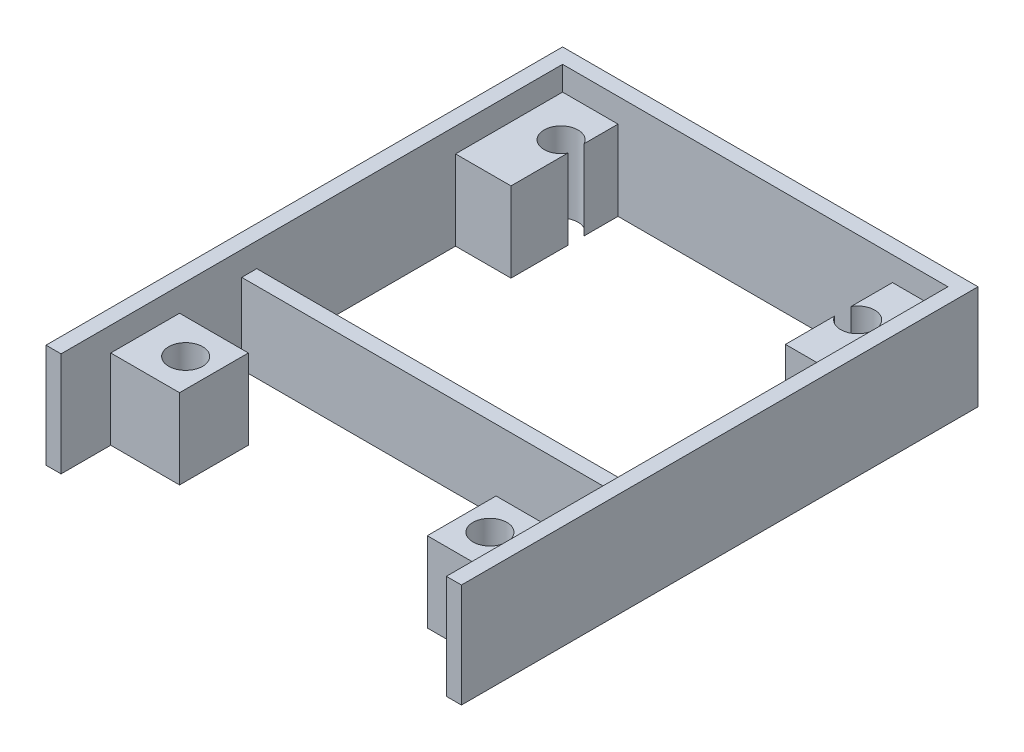
ISO-10303-21;
HEADER;
FILE_DESCRIPTION(('STEP AP214'),'2;1');
FILE_NAME('part.step','',(''),(''),'','','');
FILE_SCHEMA(('AUTOMOTIVE_DESIGN { 1 0 10303 214 1 1 1 1 }'));
ENDSEC;
DATA;
#1=APPLICATION_CONTEXT('core data for automotive mechanical design processes');
#2=APPLICATION_PROTOCOL_DEFINITION('international standard','automotive_design',2000,#1);
#3=PRODUCT_CONTEXT('',#1,'mechanical');
#4=PRODUCT('Part','Part','',(#3));
#5=PRODUCT_RELATED_PRODUCT_CATEGORY('part','',(#4));
#6=PRODUCT_DEFINITION_FORMATION('','',#4);
#7=PRODUCT_DEFINITION_CONTEXT('part definition',#1,'design');
#8=PRODUCT_DEFINITION('design','',#6,#7);
#9=PRODUCT_DEFINITION_SHAPE('','',#8);
#10=(LENGTH_UNIT() NAMED_UNIT(*) SI_UNIT(.MILLI.,.METRE.));
#11=(NAMED_UNIT(*) PLANE_ANGLE_UNIT() SI_UNIT($,.RADIAN.));
#12=(NAMED_UNIT(*) SI_UNIT($,.STERADIAN.) SOLID_ANGLE_UNIT());
#13=UNCERTAINTY_MEASURE_WITH_UNIT(LENGTH_MEASURE(1.E-05),#10,'distance_accuracy_value','');
#14=(GEOMETRIC_REPRESENTATION_CONTEXT(3) GLOBAL_UNCERTAINTY_ASSIGNED_CONTEXT((#13)) GLOBAL_UNIT_ASSIGNED_CONTEXT((#10,
#11,#12)) REPRESENTATION_CONTEXT('',''));
#15=CARTESIAN_POINT('',(0.,0.,0.));
#16=DIRECTION('',(0.,0.,1.));
#17=DIRECTION('',(1.,0.,0.));
#18=AXIS2_PLACEMENT_3D('',#15,#16,#17);
#19=CARTESIAN_POINT('',(11.9924285714286,-12.93,-8.03365714285714));
#20=DIRECTION('',(-1.,0.,0.));
#21=DIRECTION('',(0.,0.,1.));
#22=AXIS2_PLACEMENT_3D('',#19,#20,#21);
#23=PLANE('',#22);
#24=DIRECTION('',(0.,1.,0.));
#25=VECTOR('',#24,1.);
#26=CARTESIAN_POINT('',(11.9924285714286,-12.93,-8.03365714285714));
#27=LINE('',#26,#25);
#28=CARTESIAN_POINT('',(11.9924285714286,-5.31,-8.03365714285714));
#29=VERTEX_POINT('',#28);
#30=CARTESIAN_POINT('',(11.9924285714286,0.,-8.03365714285714));
#31=VERTEX_POINT('',#30);
#32=EDGE_CURVE('E305',#29,#31,#27,.T.);
#33=ORIENTED_EDGE('',*,*,#32,.F.);
#34=DIRECTION('',(0.,0.,1.));
#35=VECTOR('',#34,1.);
#36=CARTESIAN_POINT('',(11.9924285714286,-5.31,-8.03365714285714));
#37=LINE('',#36,#35);
#38=CARTESIAN_POINT('',(11.9924285714286,-5.31,-5.27598216524725));
#39=VERTEX_POINT('',#38);
#40=EDGE_CURVE('E285',#29,#39,#37,.T.);
#41=ORIENTED_EDGE('',*,*,#40,.T.);
#42=DIRECTION('',(0.,-1.,0.));
#43=VECTOR('',#42,1.);
#44=CARTESIAN_POINT('',(11.9924285714286,1.6002,-5.27598216524725));
#45=LINE('',#44,#43);
#46=CARTESIAN_POINT('',(11.9924285714286,0.,-5.27598216524725));
#47=VERTEX_POINT('',#46);
#48=EDGE_CURVE('E269',#47,#39,#45,.T.);
#49=ORIENTED_EDGE('',*,*,#48,.F.);
#50=DIRECTION('',(0.,0.,1.));
#51=VECTOR('',#50,1.);
#52=CARTESIAN_POINT('',(11.9924285714286,0.,-8.03365714285714));
#53=LINE('',#52,#51);
#54=EDGE_CURVE('E284',#31,#47,#53,.T.);
#55=ORIENTED_EDGE('',*,*,#54,.F.);
#56=EDGE_LOOP('',(#33,#41,#49,#55));
#57=FACE_BOUND('',#56,.T.);
#58=ADVANCED_FACE('F33',(#57),#23,.T.);
#59=CARTESIAN_POINT('',(-6.24477142857143,-12.93,-8.03365714285714));
#60=DIRECTION('',(1.,0.,0.));
#61=DIRECTION('',(0.,0.,-1.));
#62=AXIS2_PLACEMENT_3D('',#59,#60,#61);
#63=PLANE('',#62);
#64=DIRECTION('',(0.,1.,0.));
#65=VECTOR('',#64,1.);
#66=CARTESIAN_POINT('',(-6.24477142857143,-12.93,-0.92165714285714));
#67=LINE('',#66,#65);
#68=CARTESIAN_POINT('',(-6.24477142857143,-5.31,-0.92165714285714));
#69=VERTEX_POINT('',#68);
#70=CARTESIAN_POINT('',(-6.24477142857143,0.,-0.92165714285714));
#71=VERTEX_POINT('',#70);
#72=EDGE_CURVE('E253',#69,#71,#67,.T.);
#73=ORIENTED_EDGE('',*,*,#72,.F.);
#74=DIRECTION('',(0.,0.,-1.));
#75=VECTOR('',#74,1.);
#76=CARTESIAN_POINT('',(-6.24477142857143,-5.31,-8.03365714285714));
#77=LINE('',#76,#75);
#78=CARTESIAN_POINT('',(-6.24477142857143,-5.31,-4.69533212046702));
#79=VERTEX_POINT('',#78);
#80=EDGE_CURVE('E520',#69,#79,#77,.T.);
#81=ORIENTED_EDGE('',*,*,#80,.T.);
#82=DIRECTION('',(0.,-1.,0.));
#83=VECTOR('',#82,1.);
#84=CARTESIAN_POINT('',(-6.24477142857143,1.6002,-4.69533212046702));
#85=LINE('',#84,#83);
#86=CARTESIAN_POINT('',(-6.24477142857143,0.,-4.69533212046702));
#87=VERTEX_POINT('',#86);
#88=EDGE_CURVE('E263',#87,#79,#85,.T.);
#89=ORIENTED_EDGE('',*,*,#88,.F.);
#90=DIRECTION('',(0.,0.,-1.));
#91=VECTOR('',#90,1.);
#92=CARTESIAN_POINT('',(-6.24477142857143,0.,-8.03365714285714));
#93=LINE('',#92,#91);
#94=EDGE_CURVE('E311',#71,#87,#93,.T.);
#95=ORIENTED_EDGE('',*,*,#94,.F.);
#96=EDGE_LOOP('',(#73,#81,#89,#95));
#97=FACE_BOUND('',#96,.T.);
#98=ADVANCED_FACE('F554',(#97),#63,.T.);
#99=CARTESIAN_POINT('',(-10.9277714285714,-12.93,-9.03365714285714));
#100=DIRECTION('',(-1.,0.,0.));
#101=DIRECTION('',(0.,0.,1.));
#102=AXIS2_PLACEMENT_3D('',#99,#100,#101);
#103=PLANE('',#102);
#104=DIRECTION('',(0.,1.,0.));
#105=VECTOR('',#104,1.);
#106=CARTESIAN_POINT('',(-10.9277714285714,-12.93,-9.03365714285714));
#107=LINE('',#106,#105);
#108=CARTESIAN_POINT('',(-10.9277714285714,-5.31,-9.03365714285714));
#109=VERTEX_POINT('',#108);
#110=CARTESIAN_POINT('',(-10.9277714285714,1.6002,-9.03365714285714));
#111=VERTEX_POINT('',#110);
#112=EDGE_CURVE('E251',#109,#111,#107,.T.);
#113=ORIENTED_EDGE('',*,*,#112,.F.);
#114=DIRECTION('',(0.,0.,1.));
#115=VECTOR('',#114,1.);
#116=CARTESIAN_POINT('',(-10.9277714285714,-5.31,-9.03365714285714));
#117=LINE('',#116,#115);
#118=CARTESIAN_POINT('',(-10.9277714285714,-5.31,25.2911428571429));
#119=VERTEX_POINT('',#118);
#120=EDGE_CURVE('E483',#109,#119,#117,.T.);
#121=ORIENTED_EDGE('',*,*,#120,.T.);
#122=DIRECTION('',(0.,-1.,0.));
#123=VECTOR('',#122,1.);
#124=CARTESIAN_POINT('',(-10.9277714285714,1.6002,25.2911428571429));
#125=LINE('',#124,#123);
#126=CARTESIAN_POINT('',(-10.9277714285714,1.6002,25.2911428571429));
#127=VERTEX_POINT('',#126);
#128=EDGE_CURVE('E482',#127,#119,#125,.T.);
#129=ORIENTED_EDGE('',*,*,#128,.F.);
#130=DIRECTION('',(0.,0.,1.));
#131=VECTOR('',#130,1.);
#132=CARTESIAN_POINT('',(-10.9277714285714,1.6002,26.2911428571429));
#133=LINE('',#132,#131);
#134=EDGE_CURVE('E384',#111,#127,#133,.T.);
#135=ORIENTED_EDGE('',*,*,#134,.F.);
#136=EDGE_LOOP('',(#113,#121,#129,#135));
#137=FACE_BOUND('',#136,.T.);
#138=ADVANCED_FACE('F35',(#137),#103,.T.);
#139=CARTESIAN_POINT('',(-10.9277714285714,-12.93,-9.03365714285714));
#140=DIRECTION('',(0.,0.,-1.));
#141=DIRECTION('',(-1.,0.,0.));
#142=AXIS2_PLACEMENT_3D('',#139,#140,#141);
#143=PLANE('',#142);
#144=DIRECTION('',(0.,1.,0.));
#145=VECTOR('',#144,1.);
#146=CARTESIAN_POINT('',(16.6754285714286,-12.93,-9.03365714285714));
#147=LINE('',#146,#145);
#148=CARTESIAN_POINT('',(16.6754285714286,-5.31,-9.03365714285714));
#149=VERTEX_POINT('',#148);
#150=CARTESIAN_POINT('',(16.6754285714286,1.6002,-9.03365714285714));
#151=VERTEX_POINT('',#150);
#152=EDGE_CURVE('E248',#149,#151,#147,.T.);
#153=ORIENTED_EDGE('',*,*,#152,.F.);
#154=DIRECTION('',(-1.,0.,0.));
#155=VECTOR('',#154,1.);
#156=CARTESIAN_POINT('',(-10.9277714285714,-5.31,-9.03365714285714));
#157=LINE('',#156,#155);
#158=EDGE_CURVE('E797',#149,#109,#157,.T.);
#159=ORIENTED_EDGE('',*,*,#158,.T.);
#160=ORIENTED_EDGE('',*,*,#112,.T.);
#161=DIRECTION('',(-1.,0.,0.));
#162=VECTOR('',#161,1.);
#163=CARTESIAN_POINT('',(-10.9277714285714,1.6002,-9.03365714285714));
#164=LINE('',#163,#162);
#165=EDGE_CURVE('E467',#151,#111,#164,.T.);
#166=ORIENTED_EDGE('',*,*,#165,.F.);
#167=EDGE_LOOP('',(#153,#159,#160,#166));
#168=FACE_BOUND('',#167,.T.);
#169=ADVANCED_FACE('F676',(#168),#143,.T.);
#170=CARTESIAN_POINT('',(16.6754285714286,-12.93,-9.03365714285714));
#171=DIRECTION('',(1.,0.,0.));
#172=DIRECTION('',(0.,0.,-1.));
#173=AXIS2_PLACEMENT_3D('',#170,#171,#172);
#174=PLANE('',#173);
#175=DIRECTION('',(0.,-1.,0.));
#176=VECTOR('',#175,1.);
#177=CARTESIAN_POINT('',(16.6754285714286,1.6002,25.2911428571429));
#178=LINE('',#177,#176);
#179=CARTESIAN_POINT('',(16.6754285714286,1.6002,25.2911428571429));
#180=VERTEX_POINT('',#179);
#181=CARTESIAN_POINT('',(16.6754285714286,-5.31,25.2911428571429));
#182=VERTEX_POINT('',#181);
#183=EDGE_CURVE('E486',#180,#182,#178,.T.);
#184=ORIENTED_EDGE('',*,*,#183,.T.);
#185=DIRECTION('',(0.,0.,-1.));
#186=VECTOR('',#185,1.);
#187=CARTESIAN_POINT('',(16.6754285714286,-5.31,-9.03365714285714));
#188=LINE('',#187,#186);
#189=EDGE_CURVE('E55',#182,#149,#188,.T.);
#190=ORIENTED_EDGE('',*,*,#189,.T.);
#191=ORIENTED_EDGE('',*,*,#152,.T.);
#192=DIRECTION('',(0.,0.,-1.));
#193=VECTOR('',#192,1.);
#194=CARTESIAN_POINT('',(16.6754285714286,1.6002,26.2911428571429));
#195=LINE('',#194,#193);
#196=EDGE_CURVE('E462',#180,#151,#195,.T.);
#197=ORIENTED_EDGE('',*,*,#196,.F.);
#198=EDGE_LOOP('',(#184,#190,#191,#197));
#199=FACE_BOUND('',#198,.T.);
#200=ADVANCED_FACE('F684',(#199),#174,.T.);
#201=CARTESIAN_POINT('',(-9.92777142857143,-12.93,-8.03365714285714));
#202=DIRECTION('',(-1.,0.,0.));
#203=DIRECTION('',(0.,0.,1.));
#204=AXIS2_PLACEMENT_3D('',#201,#202,#203);
#205=PLANE('',#204);
#206=DIRECTION('',(0.,0.,1.));
#207=VECTOR('',#206,1.);
#208=CARTESIAN_POINT('',(-9.92777142857143,-5.31,-8.03365714285714));
#209=LINE('',#208,#207);
#210=CARTESIAN_POINT('',(-9.92777142857143,-5.31,-0.92165714285714));
#211=VERTEX_POINT('',#210);
#212=CARTESIAN_POINT('',(-9.92777142857143,-5.31,12.2863428571429));
#213=VERTEX_POINT('',#212);
#214=EDGE_CURVE('E48',#211,#213,#209,.T.);
#215=ORIENTED_EDGE('',*,*,#214,.F.);
#216=DIRECTION('',(0.,1.,0.));
#217=VECTOR('',#216,1.);
#218=CARTESIAN_POINT('',(-9.92777142857143,-12.93,-0.921657142857145));
#219=LINE('',#218,#217);
#220=CARTESIAN_POINT('',(-9.92777142857142,0.,-0.921657142857139));
#221=VERTEX_POINT('',#220);
#222=EDGE_CURVE('E317',#211,#221,#219,.T.);
#223=ORIENTED_EDGE('',*,*,#222,.T.);
#224=DIRECTION('',(0.,0.,1.));
#225=VECTOR('',#224,1.);
#226=CARTESIAN_POINT('',(-9.92777142857142,0.,25.2911428571429));
#227=LINE('',#226,#225);
#228=CARTESIAN_POINT('',(-9.92777142857142,0.,-8.03365714285714));
#229=VERTEX_POINT('',#228);
#230=EDGE_CURVE('E347',#229,#221,#227,.T.);
#231=ORIENTED_EDGE('',*,*,#230,.F.);
#232=DIRECTION('',(0.,-1.,0.));
#233=VECTOR('',#232,1.);
#234=CARTESIAN_POINT('',(-9.92777142857142,1.6002,-8.03365714285714));
#235=LINE('',#234,#233);
#236=CARTESIAN_POINT('',(-9.92777142857142,1.6002,-8.03365714285714));
#237=VERTEX_POINT('',#236);
#238=EDGE_CURVE('E340',#237,#229,#235,.T.);
#239=ORIENTED_EDGE('',*,*,#238,.F.);
#240=DIRECTION('',(0.,0.,1.));
#241=VECTOR('',#240,1.);
#242=CARTESIAN_POINT('',(-9.92777142857142,1.6002,25.2911428571429));
#243=LINE('',#242,#241);
#244=CARTESIAN_POINT('',(-9.92777142857142,1.6002,25.2911428571429));
#245=VERTEX_POINT('',#244);
#246=EDGE_CURVE('E346',#237,#245,#243,.T.);
#247=ORIENTED_EDGE('',*,*,#246,.T.);
#248=DIRECTION('',(0.,1.,0.));
#249=VECTOR('',#248,1.);
#250=CARTESIAN_POINT('',(-9.92777142857142,-12.93,25.2911428571429));
#251=LINE('',#250,#249);
#252=CARTESIAN_POINT('',(-9.92777142857142,-5.31,25.2911428571429));
#253=VERTEX_POINT('',#252);
#254=EDGE_CURVE('E249',#253,#245,#251,.T.);
#255=ORIENTED_EDGE('',*,*,#254,.F.);
#256=CARTESIAN_POINT('',(-9.92777142857142,-5.31,21.9891428571429));
#257=VERTEX_POINT('',#256);
#258=EDGE_CURVE('E416',#257,#253,#209,.T.);
#259=ORIENTED_EDGE('',*,*,#258,.F.);
#260=DIRECTION('',(0.,1.,0.));
#261=VECTOR('',#260,1.);
#262=CARTESIAN_POINT('',(-9.92777142857143,-12.93,21.9891428571429));
#263=LINE('',#262,#261);
#264=CARTESIAN_POINT('',(-9.92777142857142,0.,21.9891428571429));
#265=VERTEX_POINT('',#264);
#266=EDGE_CURVE('E302',#257,#265,#263,.T.);
#267=ORIENTED_EDGE('',*,*,#266,.T.);
#268=CARTESIAN_POINT('',(-9.92777142857142,0.,17.4171428571429));
#269=VERTEX_POINT('',#268);
#270=EDGE_CURVE('E264',#269,#265,#227,.T.);
#271=ORIENTED_EDGE('',*,*,#270,.F.);
#272=DIRECTION('',(0.,1.,0.));
#273=VECTOR('',#272,1.);
#274=CARTESIAN_POINT('',(-9.92777142857143,-12.93,17.4171428571429));
#275=LINE('',#274,#273);
#276=CARTESIAN_POINT('',(-9.92777142857142,-5.31,17.4171428571429));
#277=VERTEX_POINT('',#276);
#278=EDGE_CURVE('E300',#277,#269,#275,.T.);
#279=ORIENTED_EDGE('',*,*,#278,.F.);
#280=CARTESIAN_POINT('',(-9.92777142857142,-5.31,13.2863428571429));
#281=VERTEX_POINT('',#280);
#282=EDGE_CURVE('E429',#281,#277,#209,.T.);
#283=ORIENTED_EDGE('',*,*,#282,.F.);
#284=DIRECTION('',(0.,-1.,0.));
#285=VECTOR('',#284,1.);
#286=CARTESIAN_POINT('',(-9.92777142857143,25.6227213667869,13.2863428571429));
#287=LINE('',#286,#285);
#288=CARTESIAN_POINT('',(-9.92777142857142,0.,13.2863428571429));
#289=VERTEX_POINT('',#288);
#290=EDGE_CURVE('E432',#289,#281,#287,.T.);
#291=ORIENTED_EDGE('',*,*,#290,.F.);
#292=DIRECTION('',(0.,0.,-1.));
#293=VECTOR('',#292,1.);
#294=CARTESIAN_POINT('',(-9.92777142857143,0.,13.2863428571429));
#295=LINE('',#294,#293);
#296=CARTESIAN_POINT('',(-9.92777142857143,0.,12.2863428571429));
#297=VERTEX_POINT('',#296);
#298=EDGE_CURVE('E442',#289,#297,#295,.T.);
#299=ORIENTED_EDGE('',*,*,#298,.T.);
#300=DIRECTION('',(0.,-1.,0.));
#301=VECTOR('',#300,1.);
#302=CARTESIAN_POINT('',(-9.92777142857143,25.6227213667869,12.2863428571429));
#303=LINE('',#302,#301);
#304=EDGE_CURVE('E444',#297,#213,#303,.T.);
#305=ORIENTED_EDGE('',*,*,#304,.T.);
#306=EDGE_LOOP('',(#215,#223,#231,#239,#247,#255,#259,#267,#271,#279,#283,#291,#299,#305));
#307=FACE_BOUND('',#306,.T.);
#308=ADVANCED_FACE('F413',(#307),#205,.F.);
#309=CARTESIAN_POINT('',(-9.92777142857143,-12.93,-8.03365714285714));
#310=DIRECTION('',(0.,0.,-1.));
#311=DIRECTION('',(-1.,0.,0.));
#312=AXIS2_PLACEMENT_3D('',#309,#310,#311);
#313=PLANE('',#312);
#314=DIRECTION('',(-1.,0.,0.));
#315=VECTOR('',#314,1.);
#316=CARTESIAN_POINT('',(-9.92777142857143,-5.31,-8.03365714285714));
#317=LINE('',#316,#315);
#318=CARTESIAN_POINT('',(-6.24477142857143,-5.31,-8.03365714285714));
#319=VERTEX_POINT('',#318);
#320=EDGE_CURVE('E527',#29,#319,#317,.T.);
#321=ORIENTED_EDGE('',*,*,#320,.F.);
#322=ORIENTED_EDGE('',*,*,#32,.T.);
#323=DIRECTION('',(-1.,0.,0.));
#324=VECTOR('',#323,1.);
#325=CARTESIAN_POINT('',(-9.92777142857142,0.,-8.03365714285714));
#326=LINE('',#325,#324);
#327=CARTESIAN_POINT('',(15.6754285714286,0.,-8.03365714285714));
#328=VERTEX_POINT('',#327);
#329=EDGE_CURVE('E293',#328,#31,#326,.T.);
#330=ORIENTED_EDGE('',*,*,#329,.F.);
#331=DIRECTION('',(0.,-1.,0.));
#332=VECTOR('',#331,1.);
#333=CARTESIAN_POINT('',(15.6754285714286,1.6002,-8.03365714285714));
#334=LINE('',#333,#332);
#335=CARTESIAN_POINT('',(15.6754285714286,1.6002,-8.03365714285714));
#336=VERTEX_POINT('',#335);
#337=EDGE_CURVE('E461',#336,#328,#334,.T.);
#338=ORIENTED_EDGE('',*,*,#337,.F.);
#339=DIRECTION('',(-1.,0.,0.));
#340=VECTOR('',#339,1.);
#341=CARTESIAN_POINT('',(-9.92777142857142,1.6002,-8.03365714285714));
#342=LINE('',#341,#340);
#343=EDGE_CURVE('E459',#336,#237,#342,.T.);
#344=ORIENTED_EDGE('',*,*,#343,.T.);
#345=ORIENTED_EDGE('',*,*,#238,.T.);
#346=CARTESIAN_POINT('',(-6.24477142857143,0.,-8.03365714285714));
#347=VERTEX_POINT('',#346);
#348=EDGE_CURVE('E259',#347,#229,#326,.T.);
#349=ORIENTED_EDGE('',*,*,#348,.F.);
#350=DIRECTION('',(0.,1.,0.));
#351=VECTOR('',#350,1.);
#352=CARTESIAN_POINT('',(-6.24477142857143,-12.93,-8.03365714285714));
#353=LINE('',#352,#351);
#354=EDGE_CURVE('E256',#319,#347,#353,.T.);
#355=ORIENTED_EDGE('',*,*,#354,.F.);
#356=EDGE_LOOP('',(#321,#322,#330,#338,#344,#345,#349,#355));
#357=FACE_BOUND('',#356,.T.);
#358=ADVANCED_FACE('F338',(#357),#313,.F.);
#359=CARTESIAN_POINT('',(15.6754285714286,-12.93,-8.03365714285714));
#360=DIRECTION('',(1.,0.,0.));
#361=DIRECTION('',(0.,0.,-1.));
#362=AXIS2_PLACEMENT_3D('',#359,#360,#361);
#363=PLANE('',#362);
#364=DIRECTION('',(0.,0.,-1.));
#365=VECTOR('',#364,1.);
#366=CARTESIAN_POINT('',(15.6754285714286,-5.31,-8.03365714285714));
#367=LINE('',#366,#365);
#368=CARTESIAN_POINT('',(15.6754285714286,-5.31,25.2911428571429));
#369=VERTEX_POINT('',#368);
#370=CARTESIAN_POINT('',(15.6754285714286,-5.31,21.9891428571429));
#371=VERTEX_POINT('',#370);
#372=EDGE_CURVE('E229',#369,#371,#367,.T.);
#373=ORIENTED_EDGE('',*,*,#372,.F.);
#374=DIRECTION('',(0.,1.,0.));
#375=VECTOR('',#374,1.);
#376=CARTESIAN_POINT('',(15.6754285714286,-12.93,25.2911428571429));
#377=LINE('',#376,#375);
#378=CARTESIAN_POINT('',(15.6754285714286,1.6002,25.2911428571429));
#379=VERTEX_POINT('',#378);
#380=EDGE_CURVE('E238',#369,#379,#377,.T.);
#381=ORIENTED_EDGE('',*,*,#380,.T.);
#382=DIRECTION('',(0.,0.,-1.));
#383=VECTOR('',#382,1.);
#384=CARTESIAN_POINT('',(15.6754285714286,1.6002,25.2911428571429));
#385=LINE('',#384,#383);
#386=EDGE_CURVE('E349',#379,#336,#385,.T.);
#387=ORIENTED_EDGE('',*,*,#386,.T.);
#388=ORIENTED_EDGE('',*,*,#337,.T.);
#389=DIRECTION('',(0.,0.,-1.));
#390=VECTOR('',#389,1.);
#391=CARTESIAN_POINT('',(15.6754285714286,0.,25.2911428571429));
#392=LINE('',#391,#390);
#393=CARTESIAN_POINT('',(15.6754285714286,0.,-0.921657142857139));
#394=VERTEX_POINT('',#393);
#395=EDGE_CURVE('E341',#394,#328,#392,.T.);
#396=ORIENTED_EDGE('',*,*,#395,.F.);
#397=DIRECTION('',(0.,1.,0.));
#398=VECTOR('',#397,1.);
#399=CARTESIAN_POINT('',(15.6754285714286,-12.93,-0.921657142857132));
#400=LINE('',#399,#398);
#401=CARTESIAN_POINT('',(15.6754285714286,-5.31,-0.921657142857135));
#402=VERTEX_POINT('',#401);
#403=EDGE_CURVE('E308',#402,#394,#400,.T.);
#404=ORIENTED_EDGE('',*,*,#403,.F.);
#405=CARTESIAN_POINT('',(15.6754285714286,-5.31,12.2863428571429));
#406=VERTEX_POINT('',#405);
#407=EDGE_CURVE('E243',#406,#402,#367,.T.);
#408=ORIENTED_EDGE('',*,*,#407,.F.);
#409=DIRECTION('',(0.,-1.,0.));
#410=VECTOR('',#409,1.);
#411=CARTESIAN_POINT('',(15.6754285714286,25.6227213667869,12.2863428571429));
#412=LINE('',#411,#410);
#413=CARTESIAN_POINT('',(15.6754285714286,0.,12.2863428571429));
#414=VERTEX_POINT('',#413);
#415=EDGE_CURVE('E452',#414,#406,#412,.T.);
#416=ORIENTED_EDGE('',*,*,#415,.F.);
#417=DIRECTION('',(0.,0.,1.));
#418=VECTOR('',#417,1.);
#419=CARTESIAN_POINT('',(15.6754285714286,0.,13.2863428571429));
#420=LINE('',#419,#418);
#421=CARTESIAN_POINT('',(15.6754285714286,0.,13.2863428571429));
#422=VERTEX_POINT('',#421);
#423=EDGE_CURVE('E450',#414,#422,#420,.T.);
#424=ORIENTED_EDGE('',*,*,#423,.T.);
#425=DIRECTION('',(0.,-1.,0.));
#426=VECTOR('',#425,1.);
#427=CARTESIAN_POINT('',(15.6754285714286,25.6227213667869,13.2863428571429));
#428=LINE('',#427,#426);
#429=CARTESIAN_POINT('',(15.6754285714286,-5.31,13.2863428571429));
#430=VERTEX_POINT('',#429);
#431=EDGE_CURVE('E446',#422,#430,#428,.T.);
#432=ORIENTED_EDGE('',*,*,#431,.T.);
#433=CARTESIAN_POINT('',(15.6754285714286,-5.31,17.4171428571429));
#434=VERTEX_POINT('',#433);
#435=EDGE_CURVE('E244',#434,#430,#367,.T.);
#436=ORIENTED_EDGE('',*,*,#435,.F.);
#437=DIRECTION('',(0.,1.,0.));
#438=VECTOR('',#437,1.);
#439=CARTESIAN_POINT('',(15.6754285714286,-12.93,17.4171428571429));
#440=LINE('',#439,#438);
#441=CARTESIAN_POINT('',(15.6754285714286,0.,17.4171428571429));
#442=VERTEX_POINT('',#441);
#443=EDGE_CURVE('E375',#434,#442,#440,.T.);
#444=ORIENTED_EDGE('',*,*,#443,.T.);
#445=CARTESIAN_POINT('',(15.6754285714286,0.,21.9891428571429));
#446=VERTEX_POINT('',#445);
#447=EDGE_CURVE('E343',#446,#442,#392,.T.);
#448=ORIENTED_EDGE('',*,*,#447,.F.);
#449=DIRECTION('',(0.,1.,0.));
#450=VECTOR('',#449,1.);
#451=CARTESIAN_POINT('',(15.6754285714286,-12.93,21.9891428571429));
#452=LINE('',#451,#450);
#453=EDGE_CURVE('E241',#371,#446,#452,.T.);
#454=ORIENTED_EDGE('',*,*,#453,.F.);
#455=EDGE_LOOP('',(#373,#381,#387,#388,#396,#404,#408,#416,#424,#432,#436,#444,#448,#454));
#456=FACE_BOUND('',#455,.T.);
#457=ADVANCED_FACE('F236',(#456),#363,.F.);
#458=DIRECTION('',(0.,-1.,0.));
#459=VECTOR('',#458,1.);
#460=CARTESIAN_POINT('',(-6.24477142857143,1.6002,-5.78398216524726));
#461=LINE('',#460,#459);
#462=CARTESIAN_POINT('',(-6.24477142857143,-5.31,-5.78398216524726));
#463=VERTEX_POINT('',#462);
#464=CARTESIAN_POINT('',(-6.24477142857143,0.,-5.78398216524726));
#465=VERTEX_POINT('',#464);
#466=EDGE_CURVE('E261',#463,#465,#461,.F.);
#467=ORIENTED_EDGE('',*,*,#466,.F.);
#468=DIRECTION('',(0.,0.,-1.));
#469=VECTOR('',#468,1.);
#470=CARTESIAN_POINT('',(-6.24477142857143,-5.31,-8.03365714285714));
#471=LINE('',#470,#469);
#472=EDGE_CURVE('E329',#463,#319,#471,.T.);
#473=ORIENTED_EDGE('',*,*,#472,.T.);
#474=ORIENTED_EDGE('',*,*,#354,.T.);
#475=EDGE_CURVE('E307',#465,#347,#93,.T.);
#476=ORIENTED_EDGE('',*,*,#475,.F.);
#477=EDGE_LOOP('',(#467,#473,#474,#476));
#478=FACE_BOUND('',#477,.T.);
#479=ADVANCED_FACE('F328',(#478),#63,.T.);
#480=CARTESIAN_POINT('',(-6.24477142857143,-12.93,-0.92165714285714));
#481=DIRECTION('',(0.,0.,1.));
#482=DIRECTION('',(1.,0.,0.));
#483=AXIS2_PLACEMENT_3D('',#480,#481,#482);
#484=PLANE('',#483);
#485=ORIENTED_EDGE('',*,*,#222,.F.);
#486=DIRECTION('',(1.,0.,0.));
#487=VECTOR('',#486,1.);
#488=CARTESIAN_POINT('',(-6.24477142857143,-5.31,-0.92165714285714));
#489=LINE('',#488,#487);
#490=EDGE_CURVE('E517',#211,#69,#489,.T.);
#491=ORIENTED_EDGE('',*,*,#490,.T.);
#492=ORIENTED_EDGE('',*,*,#72,.T.);
#493=DIRECTION('',(1.,0.,0.));
#494=VECTOR('',#493,1.);
#495=CARTESIAN_POINT('',(-6.24477142857143,0.,-0.92165714285714));
#496=LINE('',#495,#494);
#497=EDGE_CURVE('E314',#221,#71,#496,.T.);
#498=ORIENTED_EDGE('',*,*,#497,.F.);
#499=EDGE_LOOP('',(#485,#491,#492,#498));
#500=FACE_BOUND('',#499,.T.);
#501=ADVANCED_FACE('F567',(#500),#484,.T.);
#502=DIRECTION('',(0.,-1.,0.));
#503=VECTOR('',#502,1.);
#504=CARTESIAN_POINT('',(11.9924285714286,1.6002,-4.18733212046702));
#505=LINE('',#504,#503);
#506=CARTESIAN_POINT('',(11.9924285714286,-5.31,-4.18733212046702));
#507=VERTEX_POINT('',#506);
#508=CARTESIAN_POINT('',(11.9924285714286,0.,-4.18733212046702));
#509=VERTEX_POINT('',#508);
#510=EDGE_CURVE('E267',#507,#509,#505,.F.);
#511=ORIENTED_EDGE('',*,*,#510,.F.);
#512=DIRECTION('',(0.,0.,1.));
#513=VECTOR('',#512,1.);
#514=CARTESIAN_POINT('',(11.9924285714286,-5.31,-8.03365714285714));
#515=LINE('',#514,#513);
#516=CARTESIAN_POINT('',(11.9924285714286,-5.31,-0.921657142857142));
#517=VERTEX_POINT('',#516);
#518=EDGE_CURVE('E514',#507,#517,#515,.T.);
#519=ORIENTED_EDGE('',*,*,#518,.T.);
#520=DIRECTION('',(0.,1.,0.));
#521=VECTOR('',#520,1.);
#522=CARTESIAN_POINT('',(11.9924285714286,-12.93,-0.921657142857142));
#523=LINE('',#522,#521);
#524=CARTESIAN_POINT('',(11.9924285714286,0.,-0.921657142857142));
#525=VERTEX_POINT('',#524);
#526=EDGE_CURVE('E298',#517,#525,#523,.T.);
#527=ORIENTED_EDGE('',*,*,#526,.T.);
#528=EDGE_CURVE('E295',#509,#525,#53,.T.);
#529=ORIENTED_EDGE('',*,*,#528,.F.);
#530=EDGE_LOOP('',(#511,#519,#527,#529));
#531=FACE_BOUND('',#530,.T.);
#532=ADVANCED_FACE('F556',(#531),#23,.T.);
#533=CARTESIAN_POINT('',(11.9924285714286,-12.93,-0.921657142857142));
#534=DIRECTION('',(0.,0.,1.));
#535=DIRECTION('',(1.,0.,0.));
#536=AXIS2_PLACEMENT_3D('',#533,#534,#535);
#537=PLANE('',#536);
#538=ORIENTED_EDGE('',*,*,#526,.F.);
#539=DIRECTION('',(1.,0.,0.));
#540=VECTOR('',#539,1.);
#541=CARTESIAN_POINT('',(11.9924285714286,-5.31,-0.921657142857142));
#542=LINE('',#541,#540);
#543=EDGE_CURVE('E504',#517,#402,#542,.T.);
#544=ORIENTED_EDGE('',*,*,#543,.T.);
#545=ORIENTED_EDGE('',*,*,#403,.T.);
#546=DIRECTION('',(1.,0.,0.));
#547=VECTOR('',#546,1.);
#548=CARTESIAN_POINT('',(11.9924285714286,0.,-0.921657142857142));
#549=LINE('',#548,#547);
#550=EDGE_CURVE('E294',#525,#394,#549,.T.);
#551=ORIENTED_EDGE('',*,*,#550,.F.);
#552=EDGE_LOOP('',(#538,#544,#545,#551));
#553=FACE_BOUND('',#552,.T.);
#554=ADVANCED_FACE('F566',(#553),#537,.T.);
#555=CARTESIAN_POINT('',(-9.92777142857143,-12.93,17.4171428571429));
#556=DIRECTION('',(0.,0.,-1.));
#557=DIRECTION('',(-1.,0.,0.));
#558=AXIS2_PLACEMENT_3D('',#555,#556,#557);
#559=PLANE('',#558);
#560=DIRECTION('',(0.,1.,0.));
#561=VECTOR('',#560,1.);
#562=CARTESIAN_POINT('',(-5.35577142857143,-12.93,17.4171428571429));
#563=LINE('',#562,#561);
#564=CARTESIAN_POINT('',(-5.35577142857143,-5.31,17.4171428571429));
#565=VERTEX_POINT('',#564);
#566=CARTESIAN_POINT('',(-5.35577142857143,0.,17.4171428571429));
#567=VERTEX_POINT('',#566);
#568=EDGE_CURVE('E405',#565,#567,#563,.T.);
#569=ORIENTED_EDGE('',*,*,#568,.F.);
#570=DIRECTION('',(-1.,0.,0.));
#571=VECTOR('',#570,1.);
#572=CARTESIAN_POINT('',(-9.92777142857143,-5.31,17.4171428571429));
#573=LINE('',#572,#571);
#574=EDGE_CURVE('E426',#565,#277,#573,.T.);
#575=ORIENTED_EDGE('',*,*,#574,.T.);
#576=ORIENTED_EDGE('',*,*,#278,.T.);
#577=DIRECTION('',(-1.,0.,0.));
#578=VECTOR('',#577,1.);
#579=CARTESIAN_POINT('',(-9.92777142857143,0.,17.4171428571429));
#580=LINE('',#579,#578);
#581=EDGE_CURVE('E402',#567,#269,#580,.T.);
#582=ORIENTED_EDGE('',*,*,#581,.F.);
#583=EDGE_LOOP('',(#569,#575,#576,#582));
#584=FACE_BOUND('',#583,.T.);
#585=ADVANCED_FACE('F424',(#584),#559,.T.);
#586=CARTESIAN_POINT('',(-5.35577142857143,-12.93,17.4171428571429));
#587=DIRECTION('',(1.,0.,0.));
#588=DIRECTION('',(0.,0.,-1.));
#589=AXIS2_PLACEMENT_3D('',#586,#587,#588);
#590=PLANE('',#589);
#591=DIRECTION('',(0.,1.,0.));
#592=VECTOR('',#591,1.);
#593=CARTESIAN_POINT('',(-5.35577142857142,-12.93,21.9891428571429));
#594=LINE('',#593,#592);
#595=CARTESIAN_POINT('',(-5.35577142857142,-5.31,21.9891428571429));
#596=VERTEX_POINT('',#595);
#597=CARTESIAN_POINT('',(-5.35577142857142,0.,21.9891428571429));
#598=VERTEX_POINT('',#597);
#599=EDGE_CURVE('E406',#596,#598,#594,.T.);
#600=ORIENTED_EDGE('',*,*,#599,.F.);
#601=DIRECTION('',(0.,0.,-1.));
#602=VECTOR('',#601,1.);
#603=CARTESIAN_POINT('',(-5.35577142857143,-5.31,17.4171428571429));
#604=LINE('',#603,#602);
#605=EDGE_CURVE('E785',#596,#565,#604,.T.);
#606=ORIENTED_EDGE('',*,*,#605,.T.);
#607=ORIENTED_EDGE('',*,*,#568,.T.);
#608=DIRECTION('',(0.,0.,-1.));
#609=VECTOR('',#608,1.);
#610=CARTESIAN_POINT('',(-5.35577142857143,0.,17.4171428571429));
#611=LINE('',#610,#609);
#612=EDGE_CURVE('E399',#598,#567,#611,.T.);
#613=ORIENTED_EDGE('',*,*,#612,.F.);
#614=EDGE_LOOP('',(#600,#606,#607,#613));
#615=FACE_BOUND('',#614,.T.);
#616=ADVANCED_FACE('F549',(#615),#590,.T.);
#617=CARTESIAN_POINT('',(-9.92777142857143,-12.93,21.9891428571429));
#618=DIRECTION('',(0.,0.,1.));
#619=DIRECTION('',(1.,0.,0.));
#620=AXIS2_PLACEMENT_3D('',#617,#618,#619);
#621=PLANE('',#620);
#622=ORIENTED_EDGE('',*,*,#266,.F.);
#623=DIRECTION('',(1.,0.,0.));
#624=VECTOR('',#623,1.);
#625=CARTESIAN_POINT('',(-9.92777142857143,-5.31,21.9891428571429));
#626=LINE('',#625,#624);
#627=EDGE_CURVE('E418',#257,#596,#626,.T.);
#628=ORIENTED_EDGE('',*,*,#627,.T.);
#629=ORIENTED_EDGE('',*,*,#599,.T.);
#630=DIRECTION('',(1.,0.,0.));
#631=VECTOR('',#630,1.);
#632=CARTESIAN_POINT('',(-9.92777142857143,0.,21.9891428571429));
#633=LINE('',#632,#631);
#634=EDGE_CURVE('E397',#265,#598,#633,.T.);
#635=ORIENTED_EDGE('',*,*,#634,.F.);
#636=EDGE_LOOP('',(#622,#628,#629,#635));
#637=FACE_BOUND('',#636,.T.);
#638=ADVANCED_FACE('F417',(#637),#621,.T.);
#639=CARTESIAN_POINT('',(-7.23537142857142,-12.93,19.7031428571429));
#640=DIRECTION('',(0.,1.,0.));
#641=DIRECTION('',(0.,0.,1.));
#642=AXIS2_PLACEMENT_3D('',#639,#640,#641);
#643=CYLINDRICAL_SURFACE('',#642,1.1303);
#644=CARTESIAN_POINT('',(-7.23537142857142,0.,19.7031428571429));
#645=DIRECTION('',(0.,1.,0.));
#646=DIRECTION('',(0.,0.,1.));
#647=AXIS2_PLACEMENT_3D('',#644,#645,#646);
#648=CIRCLE('',#647,1.1303);
#649=CARTESIAN_POINT('',(-7.23537142857142,0.,20.8334428571429));
#650=VERTEX_POINT('',#649);
#651=EDGE_CURVE('E390',#650,#650,#648,.T.);
#652=ORIENTED_EDGE('',*,*,#651,.T.);
#653=EDGE_LOOP('',(#652));
#654=FACE_BOUND('',#653,.T.);
#655=CARTESIAN_POINT('',(-7.23537142857142,-5.31,19.7031428571429));
#656=DIRECTION('',(0.,-1.,0.));
#657=DIRECTION('',(0.,0.,-1.));
#658=AXIS2_PLACEMENT_3D('',#655,#656,#657);
#659=CIRCLE('',#658,1.1303);
#660=CARTESIAN_POINT('',(-7.23537142857142,-5.31,18.5728428571429));
#661=VERTEX_POINT('',#660);
#662=EDGE_CURVE('E489',#661,#661,#659,.F.);
#663=ORIENTED_EDGE('',*,*,#662,.F.);
#664=EDGE_LOOP('',(#663));
#665=FACE_BOUND('',#664,.T.);
#666=ADVANCED_FACE('F537',(#654,#665),#643,.F.);
#667=CARTESIAN_POINT('',(15.6754285714286,-12.93,21.9891428571429));
#668=DIRECTION('',(0.,0.,1.));
#669=DIRECTION('',(1.,0.,0.));
#670=AXIS2_PLACEMENT_3D('',#667,#668,#669);
#671=PLANE('',#670);
#672=DIRECTION('',(0.,1.,0.));
#673=VECTOR('',#672,1.);
#674=CARTESIAN_POINT('',(11.1034285714286,-12.93,21.9891428571429));
#675=LINE('',#674,#673);
#676=CARTESIAN_POINT('',(11.1034285714286,-5.31,21.9891428571429));
#677=VERTEX_POINT('',#676);
#678=CARTESIAN_POINT('',(11.1034285714286,0.,21.9891428571429));
#679=VERTEX_POINT('',#678);
#680=EDGE_CURVE('E391',#677,#679,#675,.T.);
#681=ORIENTED_EDGE('',*,*,#680,.F.);
#682=DIRECTION('',(1.,0.,0.));
#683=VECTOR('',#682,1.);
#684=CARTESIAN_POINT('',(15.6754285714286,-5.31,21.9891428571429));
#685=LINE('',#684,#683);
#686=EDGE_CURVE('E792',#677,#371,#685,.T.);
#687=ORIENTED_EDGE('',*,*,#686,.T.);
#688=ORIENTED_EDGE('',*,*,#453,.T.);
#689=DIRECTION('',(1.,0.,0.));
#690=VECTOR('',#689,1.);
#691=CARTESIAN_POINT('',(15.6754285714286,0.,21.9891428571429));
#692=LINE('',#691,#690);
#693=EDGE_CURVE('E370',#679,#446,#692,.T.);
#694=ORIENTED_EDGE('',*,*,#693,.F.);
#695=EDGE_LOOP('',(#681,#687,#688,#694));
#696=FACE_BOUND('',#695,.T.);
#697=ADVANCED_FACE('F539',(#696),#671,.T.);
#698=CARTESIAN_POINT('',(11.1034285714286,-12.93,17.4171428571429));
#699=DIRECTION('',(-1.,0.,0.));
#700=DIRECTION('',(0.,0.,1.));
#701=AXIS2_PLACEMENT_3D('',#698,#699,#700);
#702=PLANE('',#701);
#703=DIRECTION('',(0.,1.,0.));
#704=VECTOR('',#703,1.);
#705=CARTESIAN_POINT('',(11.1034285714286,-12.93,17.4171428571429));
#706=LINE('',#705,#704);
#707=CARTESIAN_POINT('',(11.1034285714286,-5.31,17.4171428571429));
#708=VERTEX_POINT('',#707);
#709=CARTESIAN_POINT('',(11.1034285714286,0.,17.4171428571429));
#710=VERTEX_POINT('',#709);
#711=EDGE_CURVE('E377',#708,#710,#706,.T.);
#712=ORIENTED_EDGE('',*,*,#711,.F.);
#713=DIRECTION('',(0.,0.,1.));
#714=VECTOR('',#713,1.);
#715=CARTESIAN_POINT('',(11.1034285714286,-5.31,17.4171428571429));
#716=LINE('',#715,#714);
#717=EDGE_CURVE('E787',#708,#677,#716,.T.);
#718=ORIENTED_EDGE('',*,*,#717,.T.);
#719=ORIENTED_EDGE('',*,*,#680,.T.);
#720=DIRECTION('',(0.,0.,1.));
#721=VECTOR('',#720,1.);
#722=CARTESIAN_POINT('',(11.1034285714286,0.,17.4171428571429));
#723=LINE('',#722,#721);
#724=EDGE_CURVE('E379',#710,#679,#723,.T.);
#725=ORIENTED_EDGE('',*,*,#724,.F.);
#726=EDGE_LOOP('',(#712,#718,#719,#725));
#727=FACE_BOUND('',#726,.T.);
#728=ADVANCED_FACE('F546',(#727),#702,.T.);
#729=CARTESIAN_POINT('',(15.6754285714286,-12.93,17.4171428571429));
#730=DIRECTION('',(0.,0.,-1.));
#731=DIRECTION('',(-1.,0.,0.));
#732=AXIS2_PLACEMENT_3D('',#729,#730,#731);
#733=PLANE('',#732);
#734=ORIENTED_EDGE('',*,*,#443,.F.);
#735=DIRECTION('',(-1.,0.,0.));
#736=VECTOR('',#735,1.);
#737=CARTESIAN_POINT('',(15.6754285714286,-5.31,17.4171428571429));
#738=LINE('',#737,#736);
#739=EDGE_CURVE('E507',#434,#708,#738,.T.);
#740=ORIENTED_EDGE('',*,*,#739,.T.);
#741=ORIENTED_EDGE('',*,*,#711,.T.);
#742=DIRECTION('',(-1.,0.,0.));
#743=VECTOR('',#742,1.);
#744=CARTESIAN_POINT('',(15.6754285714286,0.,17.4171428571429));
#745=LINE('',#744,#743);
#746=EDGE_CURVE('E368',#442,#710,#745,.T.);
#747=ORIENTED_EDGE('',*,*,#746,.F.);
#748=EDGE_LOOP('',(#734,#740,#741,#747));
#749=FACE_BOUND('',#748,.T.);
#750=ADVANCED_FACE('F373',(#749),#733,.T.);
#751=CARTESIAN_POINT('',(12.9830285714286,-12.93,19.7031428571429));
#752=DIRECTION('',(0.,1.,0.));
#753=DIRECTION('',(0.,0.,1.));
#754=AXIS2_PLACEMENT_3D('',#751,#752,#753);
#755=CYLINDRICAL_SURFACE('',#754,1.1303);
#756=CARTESIAN_POINT('',(12.9830285714286,0.,19.7031428571429));
#757=DIRECTION('',(0.,1.,0.));
#758=DIRECTION('',(0.,0.,1.));
#759=AXIS2_PLACEMENT_3D('',#756,#757,#758);
#760=CIRCLE('',#759,1.1303);
#761=CARTESIAN_POINT('',(12.9830285714286,0.,20.8334428571429));
#762=VERTEX_POINT('',#761);
#763=EDGE_CURVE('E380',#762,#762,#760,.T.);
#764=ORIENTED_EDGE('',*,*,#763,.T.);
#765=EDGE_LOOP('',(#764));
#766=FACE_BOUND('',#765,.T.);
#767=CARTESIAN_POINT('',(12.9830285714286,-5.31,19.7031428571429));
#768=DIRECTION('',(0.,-1.,0.));
#769=DIRECTION('',(0.,0.,-1.));
#770=AXIS2_PLACEMENT_3D('',#767,#768,#769);
#771=CIRCLE('',#770,1.1303);
#772=CARTESIAN_POINT('',(12.9830285714286,-5.31,18.5728428571429));
#773=VERTEX_POINT('',#772);
#774=EDGE_CURVE('E530',#773,#773,#771,.F.);
#775=ORIENTED_EDGE('',*,*,#774,.F.);
#776=EDGE_LOOP('',(#775));
#777=FACE_BOUND('',#776,.T.);
#778=ADVANCED_FACE('F599',(#766,#777),#755,.F.);
#779=CARTESIAN_POINT('',(-7.23537142857142,1.6002,-5.23965714285714));
#780=DIRECTION('',(0.,-1.,0.));
#781=DIRECTION('',(0.,0.,-1.));
#782=AXIS2_PLACEMENT_3D('',#779,#780,#781);
#783=CYLINDRICAL_SURFACE('',#782,1.1303);
#784=CARTESIAN_POINT('',(-7.23537142857142,-5.31,-5.23965714285714));
#785=DIRECTION('',(0.,-1.,0.));
#786=DIRECTION('',(0.,0.,-1.));
#787=AXIS2_PLACEMENT_3D('',#784,#785,#786);
#788=CIRCLE('',#787,1.1303);
#789=EDGE_CURVE('E524',#463,#79,#788,.F.);
#790=ORIENTED_EDGE('',*,*,#789,.F.);
#791=ORIENTED_EDGE('',*,*,#466,.T.);
#792=CARTESIAN_POINT('',(-7.23537142857142,0.,-5.23965714285714));
#793=DIRECTION('',(0.,1.,0.));
#794=DIRECTION('',(0.,0.,1.));
#795=AXIS2_PLACEMENT_3D('',#792,#793,#794);
#796=CIRCLE('',#795,1.1303);
#797=EDGE_CURVE('E337',#465,#87,#796,.T.);
#798=ORIENTED_EDGE('',*,*,#797,.T.);
#799=ORIENTED_EDGE('',*,*,#88,.T.);
#800=EDGE_LOOP('',(#790,#791,#798,#799));
#801=FACE_BOUND('',#800,.T.);
#802=ADVANCED_FACE('F579',(#801),#783,.F.);
#803=CARTESIAN_POINT('',(12.9830285714286,1.6002,-4.73165714285714));
#804=DIRECTION('',(0.,-1.,0.));
#805=DIRECTION('',(0.,0.,-1.));
#806=AXIS2_PLACEMENT_3D('',#803,#804,#805);
#807=CYLINDRICAL_SURFACE('',#806,1.1303);
#808=CARTESIAN_POINT('',(12.9830285714286,-5.31,-4.73165714285714));
#809=DIRECTION('',(0.,-1.,0.));
#810=DIRECTION('',(0.,0.,-1.));
#811=AXIS2_PLACEMENT_3D('',#808,#809,#810);
#812=CIRCLE('',#811,1.1303);
#813=EDGE_CURVE('E275',#507,#39,#812,.F.);
#814=ORIENTED_EDGE('',*,*,#813,.F.);
#815=ORIENTED_EDGE('',*,*,#510,.T.);
#816=CARTESIAN_POINT('',(12.9830285714286,0.,-4.73165714285714));
#817=DIRECTION('',(0.,1.,0.));
#818=DIRECTION('',(0.,0.,1.));
#819=AXIS2_PLACEMENT_3D('',#816,#817,#818);
#820=CIRCLE('',#819,1.1303);
#821=EDGE_CURVE('E278',#509,#47,#820,.T.);
#822=ORIENTED_EDGE('',*,*,#821,.T.);
#823=ORIENTED_EDGE('',*,*,#48,.T.);
#824=EDGE_LOOP('',(#814,#815,#822,#823));
#825=FACE_BOUND('',#824,.T.);
#826=ADVANCED_FACE('F274',(#825),#807,.F.);
#827=CARTESIAN_POINT('',(-9.92777142857143,25.6227213667869,12.2863428571429));
#828=DIRECTION('',(0.,0.,-1.));
#829=DIRECTION('',(-1.,0.,0.));
#830=AXIS2_PLACEMENT_3D('',#827,#828,#829);
#831=PLANE('',#830);
#832=ORIENTED_EDGE('',*,*,#415,.T.);
#833=DIRECTION('',(-1.,0.,0.));
#834=VECTOR('',#833,1.);
#835=CARTESIAN_POINT('',(-9.92777142857143,-5.31,12.2863428571429));
#836=LINE('',#835,#834);
#837=EDGE_CURVE('E503',#406,#213,#836,.T.);
#838=ORIENTED_EDGE('',*,*,#837,.T.);
#839=ORIENTED_EDGE('',*,*,#304,.F.);
#840=DIRECTION('',(1.,0.,0.));
#841=VECTOR('',#840,1.);
#842=CARTESIAN_POINT('',(-9.92777142857143,0.,12.2863428571429));
#843=LINE('',#842,#841);
#844=EDGE_CURVE('E455',#297,#414,#843,.T.);
#845=ORIENTED_EDGE('',*,*,#844,.T.);
#846=EDGE_LOOP('',(#832,#838,#839,#845));
#847=FACE_BOUND('',#846,.T.);
#848=ADVANCED_FACE('F496',(#847),#831,.T.);
#849=CARTESIAN_POINT('',(-9.92777142857143,25.6227213667869,13.2863428571429));
#850=DIRECTION('',(0.,0.,1.));
#851=DIRECTION('',(1.,0.,0.));
#852=AXIS2_PLACEMENT_3D('',#849,#850,#851);
#853=PLANE('',#852);
#854=ORIENTED_EDGE('',*,*,#290,.T.);
#855=DIRECTION('',(1.,0.,0.));
#856=VECTOR('',#855,1.);
#857=CARTESIAN_POINT('',(-9.92777142857143,-5.31,13.2863428571429));
#858=LINE('',#857,#856);
#859=EDGE_CURVE('E433',#281,#430,#858,.T.);
#860=ORIENTED_EDGE('',*,*,#859,.T.);
#861=ORIENTED_EDGE('',*,*,#431,.F.);
#862=DIRECTION('',(-1.,0.,0.));
#863=VECTOR('',#862,1.);
#864=CARTESIAN_POINT('',(-9.92777142857143,0.,13.2863428571429));
#865=LINE('',#864,#863);
#866=EDGE_CURVE('E440',#422,#289,#865,.T.);
#867=ORIENTED_EDGE('',*,*,#866,.T.);
#868=EDGE_LOOP('',(#854,#860,#861,#867));
#869=FACE_BOUND('',#868,.T.);
#870=ADVANCED_FACE('F437',(#869),#853,.T.);
#871=CARTESIAN_POINT('',(-10.9277714285714,1.6002,25.2911428571429));
#872=DIRECTION('',(0.,0.,-1.));
#873=DIRECTION('',(-1.,0.,0.));
#874=AXIS2_PLACEMENT_3D('',#871,#872,#873);
#875=PLANE('',#874);
#876=DIRECTION('',(-1.,0.,0.));
#877=VECTOR('',#876,1.);
#878=CARTESIAN_POINT('',(-10.9277714285714,-5.31,25.2911428571429));
#879=LINE('',#878,#877);
#880=EDGE_CURVE('E794',#253,#119,#879,.T.);
#881=ORIENTED_EDGE('',*,*,#880,.F.);
#882=ORIENTED_EDGE('',*,*,#254,.T.);
#883=DIRECTION('',(1.,0.,0.));
#884=VECTOR('',#883,1.);
#885=CARTESIAN_POINT('',(-10.9277714285714,1.6002,25.2911428571429));
#886=LINE('',#885,#884);
#887=EDGE_CURVE('E475',#127,#245,#886,.T.);
#888=ORIENTED_EDGE('',*,*,#887,.F.);
#889=ORIENTED_EDGE('',*,*,#128,.T.);
#890=EDGE_LOOP('',(#881,#882,#888,#889));
#891=FACE_BOUND('',#890,.T.);
#892=ADVANCED_FACE('F639',(#891),#875,.F.);
#893=DIRECTION('',(-1.,0.,0.));
#894=VECTOR('',#893,1.);
#895=CARTESIAN_POINT('',(-10.9277714285714,-5.31,25.2911428571429));
#896=LINE('',#895,#894);
#897=EDGE_CURVE('E11',#182,#369,#896,.T.);
#898=ORIENTED_EDGE('',*,*,#897,.F.);
#899=ORIENTED_EDGE('',*,*,#183,.F.);
#900=DIRECTION('',(-1.,0.,0.));
#901=VECTOR('',#900,1.);
#902=CARTESIAN_POINT('',(0.,1.6002,25.2911428571429));
#903=LINE('',#902,#901);
#904=EDGE_CURVE('E41',#180,#379,#903,.T.);
#905=ORIENTED_EDGE('',*,*,#904,.T.);
#906=ORIENTED_EDGE('',*,*,#380,.F.);
#907=EDGE_LOOP('',(#898,#899,#905,#906));
#908=FACE_BOUND('',#907,.T.);
#909=ADVANCED_FACE('F245',(#908),#875,.F.);
#910=CARTESIAN_POINT('',(0.,0.,0.));
#911=DIRECTION('',(0.,1.,0.));
#912=DIRECTION('',(0.,0.,1.));
#913=AXIS2_PLACEMENT_3D('',#910,#911,#912);
#914=PLANE('',#913);
#915=ORIENTED_EDGE('',*,*,#651,.F.);
#916=EDGE_LOOP('',(#915));
#917=FACE_BOUND('',#916,.T.);
#918=ORIENTED_EDGE('',*,*,#581,.T.);
#919=ORIENTED_EDGE('',*,*,#270,.T.);
#920=ORIENTED_EDGE('',*,*,#634,.T.);
#921=ORIENTED_EDGE('',*,*,#612,.T.);
#922=EDGE_LOOP('',(#918,#919,#920,#921));
#923=FACE_BOUND('',#922,.T.);
#924=ADVANCED_FACE('F419',(#917,#923),#914,.T.);
#925=ORIENTED_EDGE('',*,*,#763,.F.);
#926=EDGE_LOOP('',(#925));
#927=FACE_BOUND('',#926,.T.);
#928=ORIENTED_EDGE('',*,*,#693,.T.);
#929=ORIENTED_EDGE('',*,*,#447,.T.);
#930=ORIENTED_EDGE('',*,*,#746,.T.);
#931=ORIENTED_EDGE('',*,*,#724,.T.);
#932=EDGE_LOOP('',(#928,#929,#930,#931));
#933=FACE_BOUND('',#932,.T.);
#934=ADVANCED_FACE('F366',(#927,#933),#914,.T.);
#935=ORIENTED_EDGE('',*,*,#821,.F.);
#936=ORIENTED_EDGE('',*,*,#528,.T.);
#937=ORIENTED_EDGE('',*,*,#550,.T.);
#938=ORIENTED_EDGE('',*,*,#395,.T.);
#939=ORIENTED_EDGE('',*,*,#329,.T.);
#940=ORIENTED_EDGE('',*,*,#54,.T.);
#941=EDGE_LOOP('',(#935,#936,#937,#938,#939,#940));
#942=FACE_BOUND('',#941,.T.);
#943=ADVANCED_FACE('F288',(#942),#914,.T.);
#944=ORIENTED_EDGE('',*,*,#797,.F.);
#945=ORIENTED_EDGE('',*,*,#475,.T.);
#946=ORIENTED_EDGE('',*,*,#348,.T.);
#947=ORIENTED_EDGE('',*,*,#230,.T.);
#948=ORIENTED_EDGE('',*,*,#497,.T.);
#949=ORIENTED_EDGE('',*,*,#94,.T.);
#950=EDGE_LOOP('',(#944,#945,#946,#947,#948,#949));
#951=FACE_BOUND('',#950,.T.);
#952=ADVANCED_FACE('F336',(#951),#914,.T.);
#953=CARTESIAN_POINT('',(0.,1.6002,0.));
#954=DIRECTION('',(0.,1.,0.));
#955=DIRECTION('',(0.,0.,1.));
#956=AXIS2_PLACEMENT_3D('',#953,#954,#955);
#957=PLANE('',#956);
#958=ORIENTED_EDGE('',*,*,#904,.F.);
#959=ORIENTED_EDGE('',*,*,#196,.T.);
#960=ORIENTED_EDGE('',*,*,#165,.T.);
#961=ORIENTED_EDGE('',*,*,#134,.T.);
#962=ORIENTED_EDGE('',*,*,#887,.T.);
#963=ORIENTED_EDGE('',*,*,#246,.F.);
#964=ORIENTED_EDGE('',*,*,#343,.F.);
#965=ORIENTED_EDGE('',*,*,#386,.F.);
#966=EDGE_LOOP('',(#958,#959,#960,#961,#962,#963,#964,#965));
#967=FACE_BOUND('',#966,.T.);
#968=ADVANCED_FACE('F473',(#967),#957,.T.);
#969=CARTESIAN_POINT('',(0.,0.,0.));
#970=DIRECTION('',(0.,1.,0.));
#971=DIRECTION('',(0.,0.,1.));
#972=AXIS2_PLACEMENT_3D('',#969,#970,#971);
#973=PLANE('',#972);
#974=ORIENTED_EDGE('',*,*,#298,.F.);
#975=ORIENTED_EDGE('',*,*,#866,.F.);
#976=ORIENTED_EDGE('',*,*,#423,.F.);
#977=ORIENTED_EDGE('',*,*,#844,.F.);
#978=EDGE_LOOP('',(#974,#975,#976,#977));
#979=FACE_BOUND('',#978,.T.);
#980=ADVANCED_FACE('F583',(#979),#973,.T.);
#981=CARTESIAN_POINT('',(0.,-5.31,0.));
#982=DIRECTION('',(0.,-1.,0.));
#983=DIRECTION('',(0.,0.,-1.));
#984=AXIS2_PLACEMENT_3D('',#981,#982,#983);
#985=PLANE('',#984);
#986=ORIENTED_EDGE('',*,*,#320,.T.);
#987=ORIENTED_EDGE('',*,*,#472,.F.);
#988=ORIENTED_EDGE('',*,*,#789,.T.);
#989=ORIENTED_EDGE('',*,*,#80,.F.);
#990=ORIENTED_EDGE('',*,*,#490,.F.);
#991=ORIENTED_EDGE('',*,*,#214,.T.);
#992=ORIENTED_EDGE('',*,*,#837,.F.);
#993=ORIENTED_EDGE('',*,*,#407,.T.);
#994=ORIENTED_EDGE('',*,*,#543,.F.);
#995=ORIENTED_EDGE('',*,*,#518,.F.);
#996=ORIENTED_EDGE('',*,*,#813,.T.);
#997=ORIENTED_EDGE('',*,*,#40,.F.);
#998=EDGE_LOOP('',(#986,#987,#988,#989,#990,#991,#992,#993,#994,#995,#996,#997));
#999=FACE_BOUND('',#998,.T.);
#1000=ORIENTED_EDGE('',*,*,#435,.T.);
#1001=ORIENTED_EDGE('',*,*,#859,.F.);
#1002=ORIENTED_EDGE('',*,*,#282,.T.);
#1003=ORIENTED_EDGE('',*,*,#574,.F.);
#1004=ORIENTED_EDGE('',*,*,#605,.F.);
#1005=ORIENTED_EDGE('',*,*,#627,.F.);
#1006=ORIENTED_EDGE('',*,*,#258,.T.);
#1007=ORIENTED_EDGE('',*,*,#880,.T.);
#1008=ORIENTED_EDGE('',*,*,#120,.F.);
#1009=ORIENTED_EDGE('',*,*,#158,.F.);
#1010=ORIENTED_EDGE('',*,*,#189,.F.);
#1011=ORIENTED_EDGE('',*,*,#897,.T.);
#1012=ORIENTED_EDGE('',*,*,#372,.T.);
#1013=ORIENTED_EDGE('',*,*,#686,.F.);
#1014=ORIENTED_EDGE('',*,*,#717,.F.);
#1015=ORIENTED_EDGE('',*,*,#739,.F.);
#1016=EDGE_LOOP('',(#1000,#1001,#1002,#1003,#1004,#1005,#1006,#1007,#1008,#1009,#1010,#1011,
#1012,#1013,#1014,#1015));
#1017=FACE_BOUND('',#1016,.T.);
#1018=ORIENTED_EDGE('',*,*,#774,.T.);
#1019=EDGE_LOOP('',(#1018));
#1020=FACE_BOUND('',#1019,.T.);
#1021=ORIENTED_EDGE('',*,*,#662,.T.);
#1022=EDGE_LOOP('',(#1021));
#1023=FACE_BOUND('',#1022,.T.);
#1024=ADVANCED_FACE('F227',(#999,#1017,#1020,#1023),#985,.T.);
#1025=CLOSED_SHELL('',(#58,#98,#138,#169,#200,#308,#358,#457,#479,#501,#532,#554,#585,#616,#638,
#666,#697,#728,#750,#778,#802,#826,#848,#870,#892,#909,#924,#934,#943,#952,#968,#980,#1024));
#1026=MANIFOLD_SOLID_BREP('B2',#1025);
#1027=ADVANCED_BREP_SHAPE_REPRESENTATION('',(#18,#1026),#14);
#1028=SHAPE_DEFINITION_REPRESENTATION(#9,#1027);
ENDSEC;
END-ISO-10303-21;
